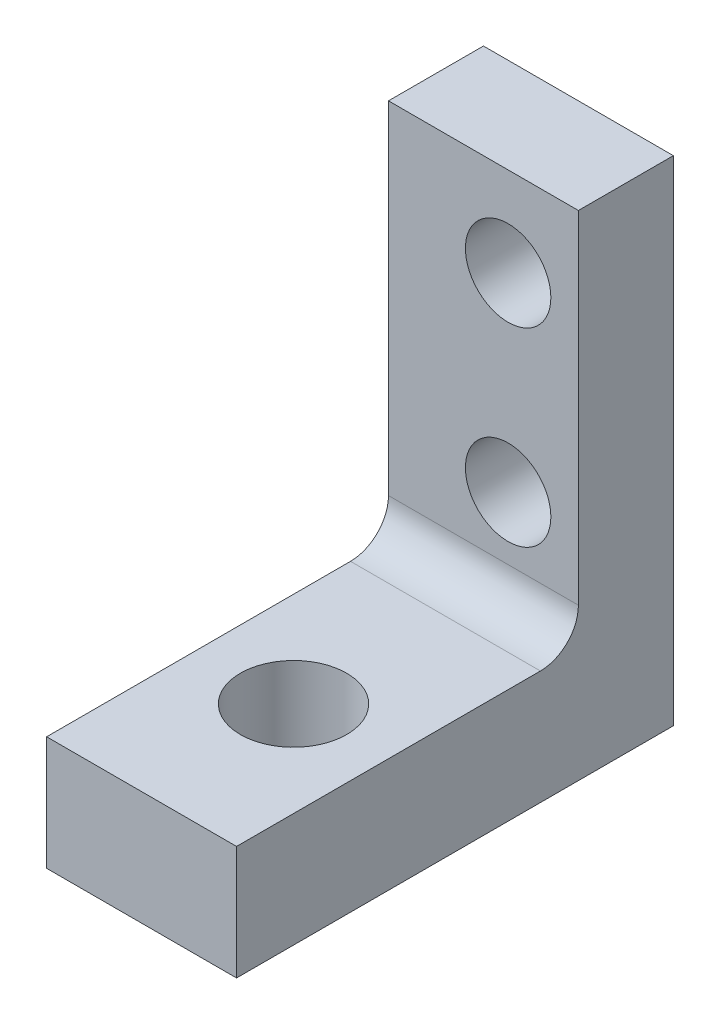
ISO-10303-21;
HEADER;
FILE_DESCRIPTION(('STEP AP214'),'2;1');
FILE_NAME('part.step','',(''),(''),'','','');
FILE_SCHEMA(('AUTOMOTIVE_DESIGN { 1 0 10303 214 1 1 1 1 }'));
ENDSEC;
DATA;
#1=APPLICATION_CONTEXT('core data for automotive mechanical design processes');
#2=APPLICATION_PROTOCOL_DEFINITION('international standard','automotive_design',2000,#1);
#3=PRODUCT_CONTEXT('',#1,'mechanical');
#4=PRODUCT('Part','Part','',(#3));
#5=PRODUCT_RELATED_PRODUCT_CATEGORY('part','',(#4));
#6=PRODUCT_DEFINITION_FORMATION('','',#4);
#7=PRODUCT_DEFINITION_CONTEXT('part definition',#1,'design');
#8=PRODUCT_DEFINITION('design','',#6,#7);
#9=PRODUCT_DEFINITION_SHAPE('','',#8);
#10=(LENGTH_UNIT() NAMED_UNIT(*) SI_UNIT(.MILLI.,.METRE.));
#11=(NAMED_UNIT(*) PLANE_ANGLE_UNIT() SI_UNIT($,.RADIAN.));
#12=(NAMED_UNIT(*) SI_UNIT($,.STERADIAN.) SOLID_ANGLE_UNIT());
#13=UNCERTAINTY_MEASURE_WITH_UNIT(LENGTH_MEASURE(1.E-05),#10,'distance_accuracy_value','');
#14=(GEOMETRIC_REPRESENTATION_CONTEXT(3) GLOBAL_UNCERTAINTY_ASSIGNED_CONTEXT((#13)) GLOBAL_UNIT_ASSIGNED_CONTEXT((#10,
#11,#12)) REPRESENTATION_CONTEXT('',''));
#15=CARTESIAN_POINT('',(0.,0.,0.));
#16=DIRECTION('',(0.,0.,1.));
#17=DIRECTION('',(1.,0.,0.));
#18=AXIS2_PLACEMENT_3D('',#15,#16,#17);
#19=CARTESIAN_POINT('',(0.,6.,0.));
#20=DIRECTION('',(0.,1.,0.));
#21=DIRECTION('',(0.,0.,1.));
#22=AXIS2_PLACEMENT_3D('',#19,#20,#21);
#23=PLANE('',#22);
#24=DIRECTION('',(0.,0.,-1.));
#25=VECTOR('',#24,1.);
#26=CARTESIAN_POINT('',(5.,6.,8.));
#27=LINE('',#26,#25);
#28=CARTESIAN_POINT('',(5.,6.,8.));
#29=VERTEX_POINT('',#28);
#30=CARTESIAN_POINT('',(5.,6.,-8.));
#31=VERTEX_POINT('',#30);
#32=EDGE_CURVE('E153',#29,#31,#27,.T.);
#33=ORIENTED_EDGE('',*,*,#32,.T.);
#34=DIRECTION('',(1.,0.,0.));
#35=VECTOR('',#34,1.);
#36=CARTESIAN_POINT('',(0.,6.,-8.));
#37=LINE('',#36,#35);
#38=CARTESIAN_POINT('',(-5.,6.,-8.));
#39=VERTEX_POINT('',#38);
#40=EDGE_CURVE('E75',#31,#39,#37,.F.);
#41=ORIENTED_EDGE('',*,*,#40,.T.);
#42=DIRECTION('',(0.,0.,1.));
#43=VECTOR('',#42,1.);
#44=CARTESIAN_POINT('',(-5.,6.,-15.));
#45=LINE('',#44,#43);
#46=CARTESIAN_POINT('',(-5.,6.,8.));
#47=VERTEX_POINT('',#46);
#48=EDGE_CURVE('E148',#39,#47,#45,.T.);
#49=ORIENTED_EDGE('',*,*,#48,.T.);
#50=DIRECTION('',(1.,0.,0.));
#51=VECTOR('',#50,1.);
#52=CARTESIAN_POINT('',(-5.,6.,8.));
#53=LINE('',#52,#51);
#54=EDGE_CURVE('E150',#47,#29,#53,.T.);
#55=ORIENTED_EDGE('',*,*,#54,.T.);
#56=EDGE_LOOP('',(#33,#41,#49,#55));
#57=FACE_BOUND('',#56,.T.);
#58=CARTESIAN_POINT('',(0.,6.,0.));
#59=DIRECTION('',(0.,1.,0.));
#60=DIRECTION('',(0.,0.,1.));
#61=AXIS2_PLACEMENT_3D('',#58,#59,#60);
#62=CIRCLE('',#61,2.8);
#63=CARTESIAN_POINT('',(0.,6.,2.8));
#64=VERTEX_POINT('',#63);
#65=EDGE_CURVE('E140',#64,#64,#62,.T.);
#66=ORIENTED_EDGE('',*,*,#65,.F.);
#67=EDGE_LOOP('',(#66));
#68=FACE_BOUND('',#67,.T.);
#69=ADVANCED_FACE('F54',(#57,#68),#23,.T.);
#70=CARTESIAN_POINT('',(0.,0.,0.));
#71=DIRECTION('',(0.,1.,0.));
#72=DIRECTION('',(0.,0.,1.));
#73=AXIS2_PLACEMENT_3D('',#70,#71,#72);
#74=PLANE('',#73);
#75=DIRECTION('',(-1.,0.,0.));
#76=VECTOR('',#75,1.);
#77=CARTESIAN_POINT('',(5.,0.,-15.));
#78=LINE('',#77,#76);
#79=CARTESIAN_POINT('',(5.,0.,-15.));
#80=VERTEX_POINT('',#79);
#81=CARTESIAN_POINT('',(-5.,0.,-15.));
#82=VERTEX_POINT('',#81);
#83=EDGE_CURVE('E146',#80,#82,#78,.T.);
#84=ORIENTED_EDGE('',*,*,#83,.F.);
#85=DIRECTION('',(0.,0.,-1.));
#86=VECTOR('',#85,1.);
#87=CARTESIAN_POINT('',(5.,0.,8.));
#88=LINE('',#87,#86);
#89=CARTESIAN_POINT('',(5.,0.,8.));
#90=VERTEX_POINT('',#89);
#91=EDGE_CURVE('E151',#90,#80,#88,.T.);
#92=ORIENTED_EDGE('',*,*,#91,.F.);
#93=DIRECTION('',(1.,0.,0.));
#94=VECTOR('',#93,1.);
#95=CARTESIAN_POINT('',(-5.,0.,8.));
#96=LINE('',#95,#94);
#97=CARTESIAN_POINT('',(-5.,0.,8.));
#98=VERTEX_POINT('',#97);
#99=EDGE_CURVE('E160',#98,#90,#96,.T.);
#100=ORIENTED_EDGE('',*,*,#99,.F.);
#101=DIRECTION('',(0.,0.,1.));
#102=VECTOR('',#101,1.);
#103=CARTESIAN_POINT('',(-5.,0.,-15.));
#104=LINE('',#103,#102);
#105=EDGE_CURVE('E158',#82,#98,#104,.T.);
#106=ORIENTED_EDGE('',*,*,#105,.F.);
#107=EDGE_LOOP('',(#84,#92,#100,#106));
#108=FACE_BOUND('',#107,.T.);
#109=CARTESIAN_POINT('',(0.,0.,0.));
#110=DIRECTION('',(0.,1.,0.));
#111=DIRECTION('',(0.,0.,1.));
#112=AXIS2_PLACEMENT_3D('',#109,#110,#111);
#113=CIRCLE('',#112,2.8);
#114=CARTESIAN_POINT('',(0.,0.,2.8));
#115=VERTEX_POINT('',#114);
#116=EDGE_CURVE('E137',#115,#115,#113,.T.);
#117=ORIENTED_EDGE('',*,*,#116,.T.);
#118=EDGE_LOOP('',(#117));
#119=FACE_BOUND('',#118,.T.);
#120=ADVANCED_FACE('F209',(#108,#119),#74,.F.);
#121=CARTESIAN_POINT('',(5.,6.,-15.));
#122=DIRECTION('',(0.,0.,1.));
#123=DIRECTION('',(1.,0.,0.));
#124=AXIS2_PLACEMENT_3D('',#121,#122,#123);
#125=PLANE('',#124);
#126=CARTESIAN_POINT('',(1.3,11.3,-15.));
#127=DIRECTION('',(0.,0.,1.));
#128=DIRECTION('',(1.,0.,0.));
#129=AXIS2_PLACEMENT_3D('',#126,#127,#128);
#130=CIRCLE('',#129,2.25);
#131=CARTESIAN_POINT('',(3.55,11.3,-15.));
#132=VERTEX_POINT('',#131);
#133=EDGE_CURVE('E133',#132,#132,#130,.T.);
#134=ORIENTED_EDGE('',*,*,#133,.T.);
#135=EDGE_LOOP('',(#134));
#136=FACE_BOUND('',#135,.T.);
#137=CARTESIAN_POINT('',(1.29999999999997,21.3,-15.));
#138=DIRECTION('',(0.,0.,1.));
#139=DIRECTION('',(1.,0.,0.));
#140=AXIS2_PLACEMENT_3D('',#137,#138,#139);
#141=CIRCLE('',#140,2.25);
#142=CARTESIAN_POINT('',(3.54999999999997,21.3,-15.));
#143=VERTEX_POINT('',#142);
#144=EDGE_CURVE('E181',#143,#143,#141,.T.);
#145=ORIENTED_EDGE('',*,*,#144,.T.);
#146=EDGE_LOOP('',(#145));
#147=FACE_BOUND('',#146,.T.);
#148=ORIENTED_EDGE('',*,*,#83,.T.);
#149=DIRECTION('',(0.,-1.,0.));
#150=VECTOR('',#149,1.);
#151=CARTESIAN_POINT('',(-5.,6.,-15.));
#152=LINE('',#151,#150);
#153=CARTESIAN_POINT('',(-5.,26.,-15.));
#154=VERTEX_POINT('',#153);
#155=EDGE_CURVE('E171',#154,#82,#152,.T.);
#156=ORIENTED_EDGE('',*,*,#155,.F.);
#157=DIRECTION('',(-1.,0.,0.));
#158=VECTOR('',#157,1.);
#159=CARTESIAN_POINT('',(-5.,26.,-15.));
#160=LINE('',#159,#158);
#161=CARTESIAN_POINT('',(5.,26.,-15.));
#162=VERTEX_POINT('',#161);
#163=EDGE_CURVE('E130',#162,#154,#160,.T.);
#164=ORIENTED_EDGE('',*,*,#163,.F.);
#165=DIRECTION('',(0.,-1.,0.));
#166=VECTOR('',#165,1.);
#167=CARTESIAN_POINT('',(5.,6.,-15.));
#168=LINE('',#167,#166);
#169=EDGE_CURVE('E155',#162,#80,#168,.T.);
#170=ORIENTED_EDGE('',*,*,#169,.T.);
#171=EDGE_LOOP('',(#148,#156,#164,#170));
#172=FACE_BOUND('',#171,.T.);
#173=ADVANCED_FACE('F206',(#136,#147,#172),#125,.F.);
#174=CARTESIAN_POINT('',(-5.,6.,-15.));
#175=DIRECTION('',(1.,0.,0.));
#176=DIRECTION('',(0.,0.,-1.));
#177=AXIS2_PLACEMENT_3D('',#174,#175,#176);
#178=PLANE('',#177);
#179=ORIENTED_EDGE('',*,*,#105,.T.);
#180=DIRECTION('',(0.,-1.,0.));
#181=VECTOR('',#180,1.);
#182=CARTESIAN_POINT('',(-5.,6.,8.));
#183=LINE('',#182,#181);
#184=EDGE_CURVE('E168',#47,#98,#183,.T.);
#185=ORIENTED_EDGE('',*,*,#184,.F.);
#186=ORIENTED_EDGE('',*,*,#48,.F.);
#187=CARTESIAN_POINT('',(-5.,8.,-8.));
#188=DIRECTION('',(1.,0.,0.));
#189=DIRECTION('',(0.,0.,-1.));
#190=AXIS2_PLACEMENT_3D('',#187,#188,#189);
#191=CIRCLE('',#190,2.);
#192=CARTESIAN_POINT('',(-5.,8.,-10.));
#193=VERTEX_POINT('',#192);
#194=EDGE_CURVE('E12',#39,#193,#191,.T.);
#195=ORIENTED_EDGE('',*,*,#194,.T.);
#196=DIRECTION('',(0.,-1.,0.));
#197=VECTOR('',#196,1.);
#198=CARTESIAN_POINT('',(-5.,26.,-10.));
#199=LINE('',#198,#197);
#200=CARTESIAN_POINT('',(-5.,26.,-10.));
#201=VERTEX_POINT('',#200);
#202=EDGE_CURVE('E117',#201,#193,#199,.T.);
#203=ORIENTED_EDGE('',*,*,#202,.F.);
#204=DIRECTION('',(0.,0.,1.));
#205=VECTOR('',#204,1.);
#206=CARTESIAN_POINT('',(-5.,26.,-10.));
#207=LINE('',#206,#205);
#208=EDGE_CURVE('E124',#154,#201,#207,.T.);
#209=ORIENTED_EDGE('',*,*,#208,.F.);
#210=ORIENTED_EDGE('',*,*,#155,.T.);
#211=EDGE_LOOP('',(#179,#185,#186,#195,#203,#209,#210));
#212=FACE_BOUND('',#211,.T.);
#213=ADVANCED_FACE('F135',(#212),#178,.F.);
#214=CARTESIAN_POINT('',(-5.,6.,8.));
#215=DIRECTION('',(0.,0.,-1.));
#216=DIRECTION('',(-1.,0.,0.));
#217=AXIS2_PLACEMENT_3D('',#214,#215,#216);
#218=PLANE('',#217);
#219=ORIENTED_EDGE('',*,*,#99,.T.);
#220=DIRECTION('',(0.,-1.,0.));
#221=VECTOR('',#220,1.);
#222=CARTESIAN_POINT('',(5.,6.,8.));
#223=LINE('',#222,#221);
#224=EDGE_CURVE('E165',#29,#90,#223,.T.);
#225=ORIENTED_EDGE('',*,*,#224,.F.);
#226=ORIENTED_EDGE('',*,*,#54,.F.);
#227=ORIENTED_EDGE('',*,*,#184,.T.);
#228=EDGE_LOOP('',(#219,#225,#226,#227));
#229=FACE_BOUND('',#228,.T.);
#230=ADVANCED_FACE('F219',(#229),#218,.F.);
#231=CARTESIAN_POINT('',(5.,6.,8.));
#232=DIRECTION('',(-1.,0.,0.));
#233=DIRECTION('',(0.,0.,1.));
#234=AXIS2_PLACEMENT_3D('',#231,#232,#233);
#235=PLANE('',#234);
#236=ORIENTED_EDGE('',*,*,#91,.T.);
#237=ORIENTED_EDGE('',*,*,#169,.F.);
#238=DIRECTION('',(0.,0.,-1.));
#239=VECTOR('',#238,1.);
#240=CARTESIAN_POINT('',(5.,26.,-15.));
#241=LINE('',#240,#239);
#242=CARTESIAN_POINT('',(5.,26.,-10.));
#243=VERTEX_POINT('',#242);
#244=EDGE_CURVE('E123',#243,#162,#241,.T.);
#245=ORIENTED_EDGE('',*,*,#244,.F.);
#246=DIRECTION('',(0.,-1.,0.));
#247=VECTOR('',#246,1.);
#248=CARTESIAN_POINT('',(5.,26.,-10.));
#249=LINE('',#248,#247);
#250=CARTESIAN_POINT('',(5.,8.,-10.));
#251=VERTEX_POINT('',#250);
#252=EDGE_CURVE('E119',#243,#251,#249,.T.);
#253=ORIENTED_EDGE('',*,*,#252,.T.);
#254=CARTESIAN_POINT('',(5.,8.,-8.));
#255=DIRECTION('',(-1.,0.,0.));
#256=DIRECTION('',(0.,0.,1.));
#257=AXIS2_PLACEMENT_3D('',#254,#255,#256);
#258=CIRCLE('',#257,2.);
#259=EDGE_CURVE('E62',#251,#31,#258,.T.);
#260=ORIENTED_EDGE('',*,*,#259,.T.);
#261=ORIENTED_EDGE('',*,*,#32,.F.);
#262=ORIENTED_EDGE('',*,*,#224,.T.);
#263=EDGE_LOOP('',(#236,#237,#245,#253,#260,#261,#262));
#264=FACE_BOUND('',#263,.T.);
#265=ADVANCED_FACE('F176',(#264),#235,.F.);
#266=CARTESIAN_POINT('',(0.,6.,0.));
#267=DIRECTION('',(0.,-1.,0.));
#268=DIRECTION('',(0.,0.,-1.));
#269=AXIS2_PLACEMENT_3D('',#266,#267,#268);
#270=CYLINDRICAL_SURFACE('',#269,2.8);
#271=ORIENTED_EDGE('',*,*,#65,.T.);
#272=EDGE_LOOP('',(#271));
#273=FACE_BOUND('',#272,.T.);
#274=ORIENTED_EDGE('',*,*,#116,.F.);
#275=EDGE_LOOP('',(#274));
#276=FACE_BOUND('',#275,.T.);
#277=ADVANCED_FACE('F196',(#273,#276),#270,.F.);
#278=CARTESIAN_POINT('',(5.,26.,-10.));
#279=DIRECTION('',(0.,0.,-1.));
#280=DIRECTION('',(-1.,0.,0.));
#281=AXIS2_PLACEMENT_3D('',#278,#279,#280);
#282=PLANE('',#281);
#283=CARTESIAN_POINT('',(1.3,11.3,-10.));
#284=DIRECTION('',(0.,0.,1.));
#285=DIRECTION('',(1.,0.,0.));
#286=AXIS2_PLACEMENT_3D('',#283,#284,#285);
#287=CIRCLE('',#286,2.25);
#288=CARTESIAN_POINT('',(3.55,11.3,-10.));
#289=VERTEX_POINT('',#288);
#290=EDGE_CURVE('E184',#289,#289,#287,.T.);
#291=ORIENTED_EDGE('',*,*,#290,.F.);
#292=EDGE_LOOP('',(#291));
#293=FACE_BOUND('',#292,.T.);
#294=CARTESIAN_POINT('',(1.29999999999997,21.3,-10.));
#295=DIRECTION('',(0.,0.,1.));
#296=DIRECTION('',(1.,0.,0.));
#297=AXIS2_PLACEMENT_3D('',#294,#295,#296);
#298=CIRCLE('',#297,2.25);
#299=CARTESIAN_POINT('',(3.54999999999997,21.3,-10.));
#300=VERTEX_POINT('',#299);
#301=EDGE_CURVE('E185',#300,#300,#298,.T.);
#302=ORIENTED_EDGE('',*,*,#301,.F.);
#303=EDGE_LOOP('',(#302));
#304=FACE_BOUND('',#303,.T.);
#305=ORIENTED_EDGE('',*,*,#202,.T.);
#306=DIRECTION('',(1.,0.,0.));
#307=VECTOR('',#306,1.);
#308=CARTESIAN_POINT('',(5.,8.,-10.));
#309=LINE('',#308,#307);
#310=EDGE_CURVE('E173',#193,#251,#309,.T.);
#311=ORIENTED_EDGE('',*,*,#310,.T.);
#312=ORIENTED_EDGE('',*,*,#252,.F.);
#313=DIRECTION('',(1.,0.,0.));
#314=VECTOR('',#313,1.);
#315=CARTESIAN_POINT('',(5.,26.,-10.));
#316=LINE('',#315,#314);
#317=EDGE_CURVE('E112',#201,#243,#316,.T.);
#318=ORIENTED_EDGE('',*,*,#317,.F.);
#319=EDGE_LOOP('',(#305,#311,#312,#318));
#320=FACE_BOUND('',#319,.T.);
#321=ADVANCED_FACE('F114',(#293,#304,#320),#282,.F.);
#322=CARTESIAN_POINT('',(0.,26.,0.));
#323=DIRECTION('',(0.,-1.,0.));
#324=DIRECTION('',(0.,0.,-1.));
#325=AXIS2_PLACEMENT_3D('',#322,#323,#324);
#326=PLANE('',#325);
#327=ORIENTED_EDGE('',*,*,#208,.T.);
#328=ORIENTED_EDGE('',*,*,#317,.T.);
#329=ORIENTED_EDGE('',*,*,#244,.T.);
#330=ORIENTED_EDGE('',*,*,#163,.T.);
#331=EDGE_LOOP('',(#327,#328,#329,#330));
#332=FACE_BOUND('',#331,.T.);
#333=ADVANCED_FACE('F128',(#332),#326,.F.);
#334=CARTESIAN_POINT('',(1.29999999999997,21.3,-20.));
#335=DIRECTION('',(0.,0.,1.));
#336=DIRECTION('',(1.,0.,0.));
#337=AXIS2_PLACEMENT_3D('',#334,#335,#336);
#338=CYLINDRICAL_SURFACE('',#337,2.25);
#339=ORIENTED_EDGE('',*,*,#301,.T.);
#340=EDGE_LOOP('',(#339));
#341=FACE_BOUND('',#340,.T.);
#342=ORIENTED_EDGE('',*,*,#144,.F.);
#343=EDGE_LOOP('',(#342));
#344=FACE_BOUND('',#343,.T.);
#345=ADVANCED_FACE('F200',(#341,#344),#338,.F.);
#346=CARTESIAN_POINT('',(1.3,11.3,-20.));
#347=DIRECTION('',(0.,0.,1.));
#348=DIRECTION('',(1.,0.,0.));
#349=AXIS2_PLACEMENT_3D('',#346,#347,#348);
#350=CYLINDRICAL_SURFACE('',#349,2.25);
#351=ORIENTED_EDGE('',*,*,#290,.T.);
#352=EDGE_LOOP('',(#351));
#353=FACE_BOUND('',#352,.T.);
#354=ORIENTED_EDGE('',*,*,#133,.F.);
#355=EDGE_LOOP('',(#354));
#356=FACE_BOUND('',#355,.T.);
#357=ADVANCED_FACE('F191',(#353,#356),#350,.F.);
#358=CARTESIAN_POINT('',(5.,8.,-8.));
#359=DIRECTION('',(1.,0.,0.));
#360=DIRECTION('',(0.,0.,-1.));
#361=AXIS2_PLACEMENT_3D('',#358,#359,#360);
#362=CYLINDRICAL_SURFACE('',#361,2.);
#363=ORIENTED_EDGE('',*,*,#194,.F.);
#364=ORIENTED_EDGE('',*,*,#40,.F.);
#365=ORIENTED_EDGE('',*,*,#259,.F.);
#366=ORIENTED_EDGE('',*,*,#310,.F.);
#367=EDGE_LOOP('',(#363,#364,#365,#366));
#368=FACE_BOUND('',#367,.T.);
#369=ADVANCED_FACE('F56',(#368),#362,.F.);
#370=CLOSED_SHELL('',(#69,#120,#173,#213,#230,#265,#277,#321,#333,#345,#357,#369));
#371=MANIFOLD_SOLID_BREP('B2',#370);
#372=ADVANCED_BREP_SHAPE_REPRESENTATION('',(#18,#371),#14);
#373=SHAPE_DEFINITION_REPRESENTATION(#9,#372);
ENDSEC;
END-ISO-10303-21;
